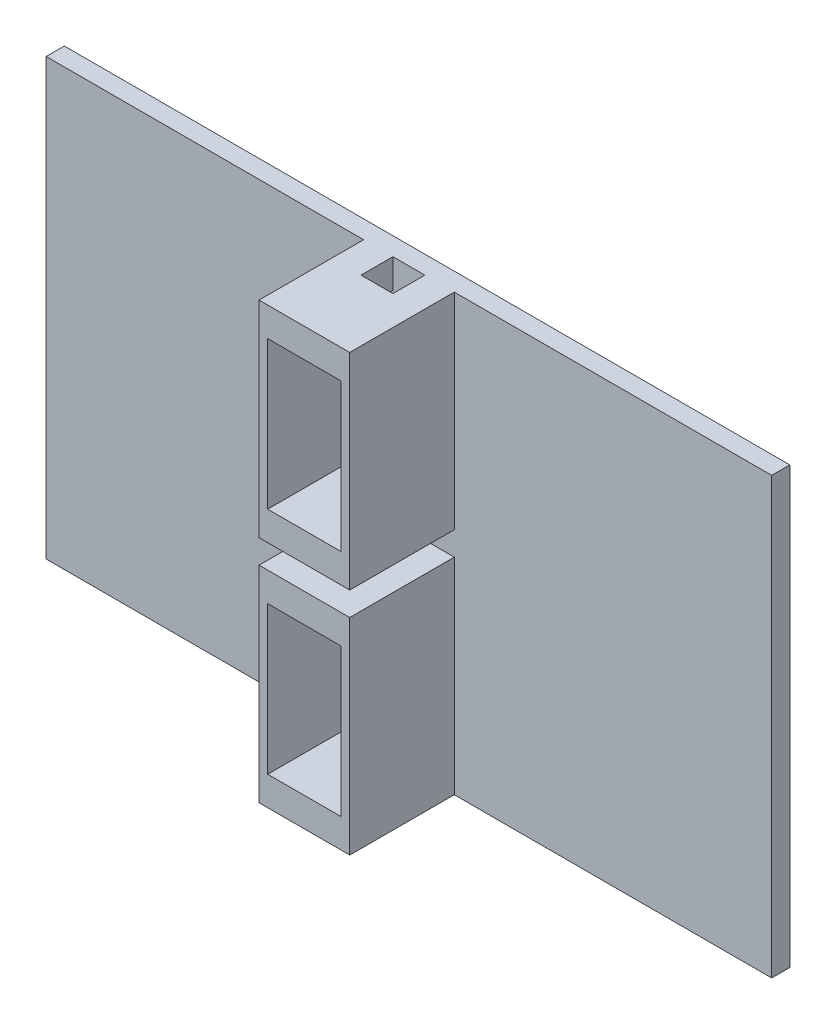
ISO-10303-21;
HEADER;
FILE_DESCRIPTION(('STEP AP214'),'2;1');
FILE_NAME('part.step','',(''),(''),'','','');
FILE_SCHEMA(('AUTOMOTIVE_DESIGN { 1 0 10303 214 1 1 1 1 }'));
ENDSEC;
DATA;
#1=APPLICATION_CONTEXT('core data for automotive mechanical design processes');
#2=APPLICATION_PROTOCOL_DEFINITION('international standard','automotive_design',2000,#1);
#3=PRODUCT_CONTEXT('',#1,'mechanical');
#4=PRODUCT('Part','Part','',(#3));
#5=PRODUCT_RELATED_PRODUCT_CATEGORY('part','',(#4));
#6=PRODUCT_DEFINITION_FORMATION('','',#4);
#7=PRODUCT_DEFINITION_CONTEXT('part definition',#1,'design');
#8=PRODUCT_DEFINITION('design','',#6,#7);
#9=PRODUCT_DEFINITION_SHAPE('','',#8);
#10=(LENGTH_UNIT() NAMED_UNIT(*) SI_UNIT(.MILLI.,.METRE.));
#11=(NAMED_UNIT(*) PLANE_ANGLE_UNIT() SI_UNIT($,.RADIAN.));
#12=(NAMED_UNIT(*) SI_UNIT($,.STERADIAN.) SOLID_ANGLE_UNIT());
#13=UNCERTAINTY_MEASURE_WITH_UNIT(LENGTH_MEASURE(1.E-05),#10,'distance_accuracy_value','');
#14=(GEOMETRIC_REPRESENTATION_CONTEXT(3) GLOBAL_UNCERTAINTY_ASSIGNED_CONTEXT((#13)) GLOBAL_UNIT_ASSIGNED_CONTEXT((#10,
#11,#12)) REPRESENTATION_CONTEXT('',''));
#15=CARTESIAN_POINT('',(0.,0.,0.));
#16=DIRECTION('',(0.,0.,1.));
#17=DIRECTION('',(1.,0.,0.));
#18=AXIS2_PLACEMENT_3D('',#15,#16,#17);
#19=CARTESIAN_POINT('',(0.,0.,33.82));
#20=DIRECTION('',(0.,0.,1.));
#21=DIRECTION('',(1.,0.,0.));
#22=AXIS2_PLACEMENT_3D('',#19,#20,#21);
#23=PLANE('',#22);
#24=DIRECTION('',(1.,0.,0.));
#25=VECTOR('',#24,1.);
#26=CARTESIAN_POINT('',(0.,-3.28,33.82));
#27=LINE('',#26,#25);
#28=CARTESIAN_POINT('',(-12.5,-3.28,33.82));
#29=VERTEX_POINT('',#28);
#30=CARTESIAN_POINT('',(12.5,-3.28,33.82));
#31=VERTEX_POINT('',#30);
#32=EDGE_CURVE('E288',#29,#31,#27,.T.);
#33=ORIENTED_EDGE('',*,*,#32,.F.);
#34=DIRECTION('',(0.,1.,0.));
#35=VECTOR('',#34,1.);
#36=CARTESIAN_POINT('',(-12.5,0.,33.82));
#37=LINE('',#36,#35);
#38=CARTESIAN_POINT('',(-12.5,-60.,33.82));
#39=VERTEX_POINT('',#38);
#40=EDGE_CURVE('E291',#39,#29,#37,.T.);
#41=ORIENTED_EDGE('',*,*,#40,.F.);
#42=DIRECTION('',(-1.,0.,0.));
#43=VECTOR('',#42,1.);
#44=CARTESIAN_POINT('',(0.,-60.,33.82));
#45=LINE('',#44,#43);
#46=CARTESIAN_POINT('',(12.5,-60.,33.82));
#47=VERTEX_POINT('',#46);
#48=EDGE_CURVE('E295',#47,#39,#45,.T.);
#49=ORIENTED_EDGE('',*,*,#48,.F.);
#50=DIRECTION('',(0.,1.,0.));
#51=VECTOR('',#50,1.);
#52=CARTESIAN_POINT('',(12.5,0.,33.82));
#53=LINE('',#52,#51);
#54=EDGE_CURVE('E298',#47,#31,#53,.T.);
#55=ORIENTED_EDGE('',*,*,#54,.T.);
#56=EDGE_LOOP('',(#33,#41,#49,#55));
#57=FACE_BOUND('',#56,.T.);
#58=DIRECTION('',(-1.,0.,0.));
#59=VECTOR('',#58,1.);
#60=CARTESIAN_POINT('',(-10.11,-52.,33.82));
#61=LINE('',#60,#59);
#62=CARTESIAN_POINT('',(10.11,-52.,33.82));
#63=VERTEX_POINT('',#62);
#64=CARTESIAN_POINT('',(-10.11,-52.,33.82));
#65=VERTEX_POINT('',#64);
#66=EDGE_CURVE('E270',#63,#65,#61,.T.);
#67=ORIENTED_EDGE('',*,*,#66,.T.);
#68=DIRECTION('',(0.,1.,0.));
#69=VECTOR('',#68,1.);
#70=CARTESIAN_POINT('',(-10.11,-52.,33.82));
#71=LINE('',#70,#69);
#72=CARTESIAN_POINT('',(-10.1099999999999,-11.28,33.82));
#73=VERTEX_POINT('',#72);
#74=EDGE_CURVE('E255',#65,#73,#71,.T.);
#75=ORIENTED_EDGE('',*,*,#74,.T.);
#76=DIRECTION('',(1.,0.,0.));
#77=VECTOR('',#76,1.);
#78=CARTESIAN_POINT('',(10.11,-11.28,33.82));
#79=LINE('',#78,#77);
#80=CARTESIAN_POINT('',(10.11,-11.28,33.82));
#81=VERTEX_POINT('',#80);
#82=EDGE_CURVE('E260',#73,#81,#79,.T.);
#83=ORIENTED_EDGE('',*,*,#82,.T.);
#84=DIRECTION('',(0.,-1.,0.));
#85=VECTOR('',#84,1.);
#86=CARTESIAN_POINT('',(10.11,-52.,33.82));
#87=LINE('',#86,#85);
#88=EDGE_CURVE('E273',#81,#63,#87,.T.);
#89=ORIENTED_EDGE('',*,*,#88,.T.);
#90=EDGE_LOOP('',(#67,#75,#83,#89));
#91=FACE_BOUND('',#90,.T.);
#92=ADVANCED_FACE('F35',(#57,#91),#23,.T.);
#93=CARTESIAN_POINT('',(100.,60.,5.));
#94=DIRECTION('',(-1.,0.,0.));
#95=DIRECTION('',(0.,0.,1.));
#96=AXIS2_PLACEMENT_3D('',#93,#94,#95);
#97=PLANE('',#96);
#98=DIRECTION('',(0.,1.,0.));
#99=VECTOR('',#98,1.);
#100=CARTESIAN_POINT('',(100.,60.,0.));
#101=LINE('',#100,#99);
#102=CARTESIAN_POINT('',(100.,-60.,0.));
#103=VERTEX_POINT('',#102);
#104=CARTESIAN_POINT('',(100.,60.,0.));
#105=VERTEX_POINT('',#104);
#106=EDGE_CURVE('E403',#103,#105,#101,.T.);
#107=ORIENTED_EDGE('',*,*,#106,.T.);
#108=DIRECTION('',(0.,0.,-1.));
#109=VECTOR('',#108,1.);
#110=CARTESIAN_POINT('',(100.,60.,5.));
#111=LINE('',#110,#109);
#112=CARTESIAN_POINT('',(100.,60.,5.));
#113=VERTEX_POINT('',#112);
#114=EDGE_CURVE('E11',#113,#105,#111,.T.);
#115=ORIENTED_EDGE('',*,*,#114,.F.);
#116=DIRECTION('',(0.,1.,0.));
#117=VECTOR('',#116,1.);
#118=CARTESIAN_POINT('',(100.,60.,5.));
#119=LINE('',#118,#117);
#120=CARTESIAN_POINT('',(100.,-60.,5.));
#121=VERTEX_POINT('',#120);
#122=EDGE_CURVE('E404',#121,#113,#119,.T.);
#123=ORIENTED_EDGE('',*,*,#122,.F.);
#124=DIRECTION('',(0.,0.,-1.));
#125=VECTOR('',#124,1.);
#126=CARTESIAN_POINT('',(100.,-60.,5.));
#127=LINE('',#126,#125);
#128=EDGE_CURVE('E418',#121,#103,#127,.T.);
#129=ORIENTED_EDGE('',*,*,#128,.T.);
#130=EDGE_LOOP('',(#107,#115,#123,#129));
#131=FACE_BOUND('',#130,.T.);
#132=ADVANCED_FACE('F37',(#131),#97,.F.);
#133=CARTESIAN_POINT('',(-100.,60.,5.));
#134=DIRECTION('',(0.,-1.,0.));
#135=DIRECTION('',(0.,0.,-1.));
#136=AXIS2_PLACEMENT_3D('',#133,#134,#135);
#137=PLANE('',#136);
#138=DIRECTION('',(1.,0.,0.));
#139=VECTOR('',#138,1.);
#140=CARTESIAN_POINT('',(-100.,60.,5.));
#141=LINE('',#140,#139);
#142=CARTESIAN_POINT('',(-4.4000000000001,60.,5.));
#143=VERTEX_POINT('',#142);
#144=CARTESIAN_POINT('',(4.3999999999999,60.,4.99999999999999));
#145=VERTEX_POINT('',#144);
#146=EDGE_CURVE('E326',#143,#145,#141,.T.);
#147=ORIENTED_EDGE('',*,*,#146,.T.);
#148=DIRECTION('',(0.,0.,1.));
#149=VECTOR('',#148,1.);
#150=CARTESIAN_POINT('',(4.39999999999989,60.,5.));
#151=LINE('',#150,#149);
#152=CARTESIAN_POINT('',(4.3999999999999,60.,13.8));
#153=VERTEX_POINT('',#152);
#154=EDGE_CURVE('E335',#145,#153,#151,.T.);
#155=ORIENTED_EDGE('',*,*,#154,.T.);
#156=DIRECTION('',(-1.,0.,0.));
#157=VECTOR('',#156,1.);
#158=CARTESIAN_POINT('',(-100.,60.,13.8));
#159=LINE('',#158,#157);
#160=CARTESIAN_POINT('',(-4.4000000000001,60.,13.8));
#161=VERTEX_POINT('',#160);
#162=EDGE_CURVE('E338',#153,#161,#159,.T.);
#163=ORIENTED_EDGE('',*,*,#162,.T.);
#164=DIRECTION('',(0.,0.,-1.));
#165=VECTOR('',#164,1.);
#166=CARTESIAN_POINT('',(-4.40000000000011,60.,5.));
#167=LINE('',#166,#165);
#168=EDGE_CURVE('E341',#161,#143,#167,.T.);
#169=ORIENTED_EDGE('',*,*,#168,.T.);
#170=EDGE_LOOP('',(#147,#155,#163,#169));
#171=FACE_BOUND('',#170,.T.);
#172=DIRECTION('',(0.,0.,-1.));
#173=VECTOR('',#172,1.);
#174=CARTESIAN_POINT('',(12.5,60.,33.82));
#175=LINE('',#174,#173);
#176=CARTESIAN_POINT('',(12.5,60.,33.82));
#177=VERTEX_POINT('',#176);
#178=CARTESIAN_POINT('',(12.5,60.,5.));
#179=VERTEX_POINT('',#178);
#180=EDGE_CURVE('E398',#177,#179,#175,.T.);
#181=ORIENTED_EDGE('',*,*,#180,.T.);
#182=DIRECTION('',(-1.,0.,0.));
#183=VECTOR('',#182,1.);
#184=CARTESIAN_POINT('',(-100.,60.,5.));
#185=LINE('',#184,#183);
#186=EDGE_CURVE('E409',#113,#179,#185,.T.);
#187=ORIENTED_EDGE('',*,*,#186,.F.);
#188=ORIENTED_EDGE('',*,*,#114,.T.);
#189=DIRECTION('',(-1.,0.,0.));
#190=VECTOR('',#189,1.);
#191=CARTESIAN_POINT('',(-100.,60.,0.));
#192=LINE('',#191,#190);
#193=CARTESIAN_POINT('',(-100.,60.,0.));
#194=VERTEX_POINT('',#193);
#195=EDGE_CURVE('E421',#105,#194,#192,.T.);
#196=ORIENTED_EDGE('',*,*,#195,.T.);
#197=DIRECTION('',(0.,0.,-1.));
#198=VECTOR('',#197,1.);
#199=CARTESIAN_POINT('',(-100.,60.,5.));
#200=LINE('',#199,#198);
#201=CARTESIAN_POINT('',(-100.,60.,5.));
#202=VERTEX_POINT('',#201);
#203=EDGE_CURVE('E43',#202,#194,#200,.T.);
#204=ORIENTED_EDGE('',*,*,#203,.F.);
#205=CARTESIAN_POINT('',(-12.5,60.,5.));
#206=VERTEX_POINT('',#205);
#207=EDGE_CURVE('E407',#206,#202,#185,.T.);
#208=ORIENTED_EDGE('',*,*,#207,.F.);
#209=DIRECTION('',(0.,0.,-1.));
#210=VECTOR('',#209,1.);
#211=CARTESIAN_POINT('',(-12.5,60.,33.82));
#212=LINE('',#211,#210);
#213=CARTESIAN_POINT('',(-12.5,60.,33.82));
#214=VERTEX_POINT('',#213);
#215=EDGE_CURVE('E396',#214,#206,#212,.T.);
#216=ORIENTED_EDGE('',*,*,#215,.F.);
#217=DIRECTION('',(-1.,0.,0.));
#218=VECTOR('',#217,1.);
#219=CARTESIAN_POINT('',(0.,60.,33.82));
#220=LINE('',#219,#218);
#221=EDGE_CURVE('E384',#177,#214,#220,.T.);
#222=ORIENTED_EDGE('',*,*,#221,.F.);
#223=EDGE_LOOP('',(#181,#187,#188,#196,#204,#208,#216,#222));
#224=FACE_BOUND('',#223,.T.);
#225=ADVANCED_FACE('F470',(#171,#224),#137,.F.);
#226=CARTESIAN_POINT('',(-100.,60.,5.));
#227=DIRECTION('',(1.,0.,0.));
#228=DIRECTION('',(0.,0.,-1.));
#229=AXIS2_PLACEMENT_3D('',#226,#227,#228);
#230=PLANE('',#229);
#231=DIRECTION('',(0.,-1.,0.));
#232=VECTOR('',#231,1.);
#233=CARTESIAN_POINT('',(-100.,60.,0.));
#234=LINE('',#233,#232);
#235=CARTESIAN_POINT('',(-100.,-60.,0.));
#236=VERTEX_POINT('',#235);
#237=EDGE_CURVE('E423',#194,#236,#234,.T.);
#238=ORIENTED_EDGE('',*,*,#237,.T.);
#239=DIRECTION('',(0.,0.,-1.));
#240=VECTOR('',#239,1.);
#241=CARTESIAN_POINT('',(-100.,-60.,5.));
#242=LINE('',#241,#240);
#243=CARTESIAN_POINT('',(-100.,-60.,5.));
#244=VERTEX_POINT('',#243);
#245=EDGE_CURVE('E428',#244,#236,#242,.T.);
#246=ORIENTED_EDGE('',*,*,#245,.F.);
#247=DIRECTION('',(0.,-1.,0.));
#248=VECTOR('',#247,1.);
#249=CARTESIAN_POINT('',(-100.,60.,5.));
#250=LINE('',#249,#248);
#251=EDGE_CURVE('E412',#202,#244,#250,.T.);
#252=ORIENTED_EDGE('',*,*,#251,.F.);
#253=ORIENTED_EDGE('',*,*,#203,.T.);
#254=EDGE_LOOP('',(#238,#246,#252,#253));
#255=FACE_BOUND('',#254,.T.);
#256=ADVANCED_FACE('F435',(#255),#230,.F.);
#257=CARTESIAN_POINT('',(-100.,-60.,5.));
#258=DIRECTION('',(0.,1.,0.));
#259=DIRECTION('',(0.,0.,1.));
#260=AXIS2_PLACEMENT_3D('',#257,#258,#259);
#261=PLANE('',#260);
#262=DIRECTION('',(-1.,0.,0.));
#263=VECTOR('',#262,1.);
#264=CARTESIAN_POINT('',(-100.,-60.,5.));
#265=LINE('',#264,#263);
#266=CARTESIAN_POINT('',(4.3999999999997,-60.,4.99999999999999));
#267=VERTEX_POINT('',#266);
#268=CARTESIAN_POINT('',(-4.40000000000031,-60.,5.));
#269=VERTEX_POINT('',#268);
#270=EDGE_CURVE('E250',#267,#269,#265,.T.);
#271=ORIENTED_EDGE('',*,*,#270,.T.);
#272=DIRECTION('',(0.,0.,1.));
#273=VECTOR('',#272,1.);
#274=CARTESIAN_POINT('',(-4.40000000000032,-60.,5.));
#275=LINE('',#274,#273);
#276=CARTESIAN_POINT('',(-4.40000000000031,-60.,13.8));
#277=VERTEX_POINT('',#276);
#278=EDGE_CURVE('E253',#269,#277,#275,.T.);
#279=ORIENTED_EDGE('',*,*,#278,.T.);
#280=DIRECTION('',(1.,0.,0.));
#281=VECTOR('',#280,1.);
#282=CARTESIAN_POINT('',(-100.,-60.,13.8));
#283=LINE('',#282,#281);
#284=CARTESIAN_POINT('',(4.3999999999997,-60.,13.8));
#285=VERTEX_POINT('',#284);
#286=EDGE_CURVE('E225',#277,#285,#283,.T.);
#287=ORIENTED_EDGE('',*,*,#286,.T.);
#288=DIRECTION('',(0.,0.,-1.));
#289=VECTOR('',#288,1.);
#290=CARTESIAN_POINT('',(4.3999999999997,-60.,5.00000000000008));
#291=LINE('',#290,#289);
#292=EDGE_CURVE('E247',#285,#267,#291,.T.);
#293=ORIENTED_EDGE('',*,*,#292,.T.);
#294=EDGE_LOOP('',(#271,#279,#287,#293));
#295=FACE_BOUND('',#294,.T.);
#296=DIRECTION('',(1.,0.,0.));
#297=VECTOR('',#296,1.);
#298=CARTESIAN_POINT('',(-100.,-60.,0.));
#299=LINE('',#298,#297);
#300=EDGE_CURVE('E408',#236,#103,#299,.T.);
#301=ORIENTED_EDGE('',*,*,#300,.T.);
#302=ORIENTED_EDGE('',*,*,#128,.F.);
#303=DIRECTION('',(1.,0.,0.));
#304=VECTOR('',#303,1.);
#305=CARTESIAN_POINT('',(-100.,-60.,5.));
#306=LINE('',#305,#304);
#307=CARTESIAN_POINT('',(12.5,-60.,5.));
#308=VERTEX_POINT('',#307);
#309=EDGE_CURVE('E414',#308,#121,#306,.T.);
#310=ORIENTED_EDGE('',*,*,#309,.F.);
#311=DIRECTION('',(0.,0.,-1.));
#312=VECTOR('',#311,1.);
#313=CARTESIAN_POINT('',(12.5,-60.,33.82));
#314=LINE('',#313,#312);
#315=EDGE_CURVE('E309',#47,#308,#314,.T.);
#316=ORIENTED_EDGE('',*,*,#315,.F.);
#317=ORIENTED_EDGE('',*,*,#48,.T.);
#318=DIRECTION('',(0.,0.,-1.));
#319=VECTOR('',#318,1.);
#320=CARTESIAN_POINT('',(-12.5,-60.,33.82));
#321=LINE('',#320,#319);
#322=CARTESIAN_POINT('',(-12.5,-60.,5.));
#323=VERTEX_POINT('',#322);
#324=EDGE_CURVE('E311',#39,#323,#321,.T.);
#325=ORIENTED_EDGE('',*,*,#324,.T.);
#326=EDGE_CURVE('E415',#244,#323,#306,.T.);
#327=ORIENTED_EDGE('',*,*,#326,.F.);
#328=ORIENTED_EDGE('',*,*,#245,.T.);
#329=EDGE_LOOP('',(#301,#302,#310,#316,#317,#325,#327,#328));
#330=FACE_BOUND('',#329,.T.);
#331=ADVANCED_FACE('F445',(#295,#330),#261,.F.);
#332=CARTESIAN_POINT('',(0.,0.,5.));
#333=DIRECTION('',(0.,0.,1.));
#334=DIRECTION('',(1.,0.,0.));
#335=AXIS2_PLACEMENT_3D('',#332,#333,#334);
#336=PLANE('',#335);
#337=DIRECTION('',(0.,1.,0.));
#338=VECTOR('',#337,1.);
#339=CARTESIAN_POINT('',(-12.5,0.,5.));
#340=LINE('',#339,#338);
#341=CARTESIAN_POINT('',(-12.5,-3.28,5.));
#342=VERTEX_POINT('',#341);
#343=EDGE_CURVE('E303',#323,#342,#340,.T.);
#344=ORIENTED_EDGE('',*,*,#343,.T.);
#345=DIRECTION('',(1.,0.,0.));
#346=VECTOR('',#345,1.);
#347=CARTESIAN_POINT('',(0.,-3.28,5.));
#348=LINE('',#347,#346);
#349=CARTESIAN_POINT('',(12.5,-3.28,5.));
#350=VERTEX_POINT('',#349);
#351=EDGE_CURVE('E281',#342,#350,#348,.T.);
#352=ORIENTED_EDGE('',*,*,#351,.T.);
#353=DIRECTION('',(0.,1.,0.));
#354=VECTOR('',#353,1.);
#355=CARTESIAN_POINT('',(12.5,0.,5.));
#356=LINE('',#355,#354);
#357=EDGE_CURVE('E292',#308,#350,#356,.T.);
#358=ORIENTED_EDGE('',*,*,#357,.F.);
#359=ORIENTED_EDGE('',*,*,#309,.T.);
#360=ORIENTED_EDGE('',*,*,#122,.T.);
#361=ORIENTED_EDGE('',*,*,#186,.T.);
#362=DIRECTION('',(0.,-1.,0.));
#363=VECTOR('',#362,1.);
#364=CARTESIAN_POINT('',(12.5,0.,5.));
#365=LINE('',#364,#363);
#366=CARTESIAN_POINT('',(12.5,3.28,5.));
#367=VERTEX_POINT('',#366);
#368=EDGE_CURVE('E390',#179,#367,#365,.T.);
#369=ORIENTED_EDGE('',*,*,#368,.T.);
#370=DIRECTION('',(1.,0.,0.));
#371=VECTOR('',#370,1.);
#372=CARTESIAN_POINT('',(0.,3.28,5.));
#373=LINE('',#372,#371);
#374=CARTESIAN_POINT('',(-12.5,3.28,5.));
#375=VERTEX_POINT('',#374);
#376=EDGE_CURVE('E371',#375,#367,#373,.T.);
#377=ORIENTED_EDGE('',*,*,#376,.F.);
#378=DIRECTION('',(0.,-1.,0.));
#379=VECTOR('',#378,1.);
#380=CARTESIAN_POINT('',(-12.5,0.,5.));
#381=LINE('',#380,#379);
#382=EDGE_CURVE('E381',#206,#375,#381,.T.);
#383=ORIENTED_EDGE('',*,*,#382,.F.);
#384=ORIENTED_EDGE('',*,*,#207,.T.);
#385=ORIENTED_EDGE('',*,*,#251,.T.);
#386=ORIENTED_EDGE('',*,*,#326,.T.);
#387=EDGE_LOOP('',(#344,#352,#358,#359,#360,#361,#369,#377,#383,#384,#385,#386));
#388=FACE_BOUND('',#387,.T.);
#389=ADVANCED_FACE('F452',(#388),#336,.T.);
#390=CARTESIAN_POINT('',(0.,0.,0.));
#391=DIRECTION('',(0.,0.,1.));
#392=DIRECTION('',(1.,0.,0.));
#393=AXIS2_PLACEMENT_3D('',#390,#391,#392);
#394=PLANE('',#393);
#395=ORIENTED_EDGE('',*,*,#106,.F.);
#396=ORIENTED_EDGE('',*,*,#300,.F.);
#397=ORIENTED_EDGE('',*,*,#237,.F.);
#398=ORIENTED_EDGE('',*,*,#195,.F.);
#399=EDGE_LOOP('',(#395,#396,#397,#398));
#400=FACE_BOUND('',#399,.T.);
#401=ADVANCED_FACE('F442',(#400),#394,.F.);
#402=CARTESIAN_POINT('',(0.,3.28,33.82));
#403=DIRECTION('',(0.,1.,0.));
#404=DIRECTION('',(0.,0.,1.));
#405=AXIS2_PLACEMENT_3D('',#402,#403,#404);
#406=PLANE('',#405);
#407=ORIENTED_EDGE('',*,*,#376,.T.);
#408=DIRECTION('',(0.,0.,-1.));
#409=VECTOR('',#408,1.);
#410=CARTESIAN_POINT('',(12.5,3.28,33.82));
#411=LINE('',#410,#409);
#412=CARTESIAN_POINT('',(12.5,3.28,33.82));
#413=VERTEX_POINT('',#412);
#414=EDGE_CURVE('E400',#413,#367,#411,.T.);
#415=ORIENTED_EDGE('',*,*,#414,.F.);
#416=DIRECTION('',(1.,0.,0.));
#417=VECTOR('',#416,1.);
#418=CARTESIAN_POINT('',(0.,3.28,33.82));
#419=LINE('',#418,#417);
#420=CARTESIAN_POINT('',(-12.5,3.28,33.82));
#421=VERTEX_POINT('',#420);
#422=EDGE_CURVE('E378',#421,#413,#419,.T.);
#423=ORIENTED_EDGE('',*,*,#422,.F.);
#424=DIRECTION('',(0.,0.,-1.));
#425=VECTOR('',#424,1.);
#426=CARTESIAN_POINT('',(-12.5,3.28,33.82));
#427=LINE('',#426,#425);
#428=EDGE_CURVE('E388',#421,#375,#427,.T.);
#429=ORIENTED_EDGE('',*,*,#428,.T.);
#430=EDGE_LOOP('',(#407,#415,#423,#429));
#431=FACE_BOUND('',#430,.T.);
#432=ADVANCED_FACE('F485',(#431),#406,.F.);
#433=CARTESIAN_POINT('',(12.5,0.,33.82));
#434=DIRECTION('',(1.,0.,0.));
#435=DIRECTION('',(0.,1.,0.));
#436=AXIS2_PLACEMENT_3D('',#433,#434,#435);
#437=PLANE('',#436);
#438=ORIENTED_EDGE('',*,*,#368,.F.);
#439=ORIENTED_EDGE('',*,*,#180,.F.);
#440=DIRECTION('',(0.,-1.,0.));
#441=VECTOR('',#440,1.);
#442=CARTESIAN_POINT('',(12.5,0.,33.82));
#443=LINE('',#442,#441);
#444=EDGE_CURVE('E380',#177,#413,#443,.T.);
#445=ORIENTED_EDGE('',*,*,#444,.T.);
#446=ORIENTED_EDGE('',*,*,#414,.T.);
#447=EDGE_LOOP('',(#438,#439,#445,#446));
#448=FACE_BOUND('',#447,.T.);
#449=ADVANCED_FACE('F483',(#448),#437,.T.);
#450=CARTESIAN_POINT('',(-12.5,0.,33.82));
#451=DIRECTION('',(1.,0.,0.));
#452=DIRECTION('',(0.,1.,0.));
#453=AXIS2_PLACEMENT_3D('',#450,#451,#452);
#454=PLANE('',#453);
#455=ORIENTED_EDGE('',*,*,#382,.T.);
#456=ORIENTED_EDGE('',*,*,#428,.F.);
#457=DIRECTION('',(0.,-1.,0.));
#458=VECTOR('',#457,1.);
#459=CARTESIAN_POINT('',(-12.5,0.,33.82));
#460=LINE('',#459,#458);
#461=EDGE_CURVE('E386',#214,#421,#460,.T.);
#462=ORIENTED_EDGE('',*,*,#461,.F.);
#463=ORIENTED_EDGE('',*,*,#215,.T.);
#464=EDGE_LOOP('',(#455,#456,#462,#463));
#465=FACE_BOUND('',#464,.T.);
#466=ADVANCED_FACE('F476',(#465),#454,.F.);
#467=CARTESIAN_POINT('',(0.,0.,33.82));
#468=DIRECTION('',(0.,0.,1.));
#469=DIRECTION('',(1.,0.,0.));
#470=AXIS2_PLACEMENT_3D('',#467,#468,#469);
#471=PLANE('',#470);
#472=DIRECTION('',(0.,-1.,0.));
#473=VECTOR('',#472,1.);
#474=CARTESIAN_POINT('',(-10.11,52.,33.82));
#475=LINE('',#474,#473);
#476=CARTESIAN_POINT('',(-10.11,52.,33.82));
#477=VERTEX_POINT('',#476);
#478=CARTESIAN_POINT('',(-10.1099999999999,11.28,33.82));
#479=VERTEX_POINT('',#478);
#480=EDGE_CURVE('E344',#477,#479,#475,.T.);
#481=ORIENTED_EDGE('',*,*,#480,.F.);
#482=DIRECTION('',(-1.,0.,0.));
#483=VECTOR('',#482,1.);
#484=CARTESIAN_POINT('',(-10.11,52.,33.82));
#485=LINE('',#484,#483);
#486=CARTESIAN_POINT('',(10.11,52.,33.82));
#487=VERTEX_POINT('',#486);
#488=EDGE_CURVE('E349',#487,#477,#485,.T.);
#489=ORIENTED_EDGE('',*,*,#488,.F.);
#490=DIRECTION('',(0.,1.,0.));
#491=VECTOR('',#490,1.);
#492=CARTESIAN_POINT('',(10.11,52.,33.82));
#493=LINE('',#492,#491);
#494=CARTESIAN_POINT('',(10.11,11.28,33.82));
#495=VERTEX_POINT('',#494);
#496=EDGE_CURVE('E364',#495,#487,#493,.T.);
#497=ORIENTED_EDGE('',*,*,#496,.F.);
#498=DIRECTION('',(1.,0.,0.));
#499=VECTOR('',#498,1.);
#500=CARTESIAN_POINT('',(10.11,11.28,33.82));
#501=LINE('',#500,#499);
#502=EDGE_CURVE('E361',#479,#495,#501,.T.);
#503=ORIENTED_EDGE('',*,*,#502,.F.);
#504=EDGE_LOOP('',(#481,#489,#497,#503));
#505=FACE_BOUND('',#504,.T.);
#506=ORIENTED_EDGE('',*,*,#422,.T.);
#507=ORIENTED_EDGE('',*,*,#444,.F.);
#508=ORIENTED_EDGE('',*,*,#221,.T.);
#509=ORIENTED_EDGE('',*,*,#461,.T.);
#510=EDGE_LOOP('',(#506,#507,#508,#509));
#511=FACE_BOUND('',#510,.T.);
#512=ADVANCED_FACE('F479',(#505,#511),#471,.T.);
#513=CARTESIAN_POINT('',(-10.11,52.,5.));
#514=DIRECTION('',(-1.,0.,0.));
#515=DIRECTION('',(0.,-1.,0.));
#516=AXIS2_PLACEMENT_3D('',#513,#514,#515);
#517=PLANE('',#516);
#518=ORIENTED_EDGE('',*,*,#480,.T.);
#519=DIRECTION('',(0.,0.,1.));
#520=VECTOR('',#519,1.);
#521=CARTESIAN_POINT('',(-10.1099999999999,11.28,5.));
#522=LINE('',#521,#520);
#523=CARTESIAN_POINT('',(-10.1099999999999,11.28,5.));
#524=VERTEX_POINT('',#523);
#525=EDGE_CURVE('E359',#524,#479,#522,.T.);
#526=ORIENTED_EDGE('',*,*,#525,.F.);
#527=DIRECTION('',(0.,-1.,0.));
#528=VECTOR('',#527,1.);
#529=CARTESIAN_POINT('',(-10.11,52.,5.));
#530=LINE('',#529,#528);
#531=CARTESIAN_POINT('',(-10.11,52.,5.));
#532=VERTEX_POINT('',#531);
#533=EDGE_CURVE('E345',#532,#524,#530,.T.);
#534=ORIENTED_EDGE('',*,*,#533,.F.);
#535=DIRECTION('',(0.,0.,1.));
#536=VECTOR('',#535,1.);
#537=CARTESIAN_POINT('',(-10.11,52.,5.));
#538=LINE('',#537,#536);
#539=EDGE_CURVE('E369',#532,#477,#538,.T.);
#540=ORIENTED_EDGE('',*,*,#539,.T.);
#541=EDGE_LOOP('',(#518,#526,#534,#540));
#542=FACE_BOUND('',#541,.T.);
#543=ADVANCED_FACE('F533',(#542),#517,.F.);
#544=CARTESIAN_POINT('',(-10.11,52.,5.));
#545=DIRECTION('',(0.,1.,0.));
#546=DIRECTION('',(-1.,0.,0.));
#547=AXIS2_PLACEMENT_3D('',#544,#545,#546);
#548=PLANE('',#547);
#549=DIRECTION('',(-1.,0.,0.));
#550=VECTOR('',#549,1.);
#551=CARTESIAN_POINT('',(-10.11,52.,5.));
#552=LINE('',#551,#550);
#553=CARTESIAN_POINT('',(-4.40000000000009,52.,5.));
#554=VERTEX_POINT('',#553);
#555=EDGE_CURVE('E355',#554,#532,#552,.T.);
#556=ORIENTED_EDGE('',*,*,#555,.F.);
#557=DIRECTION('',(0.,0.,-1.));
#558=VECTOR('',#557,1.);
#559=CARTESIAN_POINT('',(-4.40000000000009,52.,5.));
#560=LINE('',#559,#558);
#561=CARTESIAN_POINT('',(-4.40000000000009,52.,13.8));
#562=VERTEX_POINT('',#561);
#563=EDGE_CURVE('E315',#562,#554,#560,.T.);
#564=ORIENTED_EDGE('',*,*,#563,.F.);
#565=DIRECTION('',(-1.,0.,0.));
#566=VECTOR('',#565,1.);
#567=CARTESIAN_POINT('',(-4.40000000000009,52.,13.8));
#568=LINE('',#567,#566);
#569=CARTESIAN_POINT('',(4.39999999999991,52.,13.8));
#570=VERTEX_POINT('',#569);
#571=EDGE_CURVE('E320',#570,#562,#568,.T.);
#572=ORIENTED_EDGE('',*,*,#571,.F.);
#573=DIRECTION('',(0.,0.,1.));
#574=VECTOR('',#573,1.);
#575=CARTESIAN_POINT('',(4.39999999999991,52.,13.8));
#576=LINE('',#575,#574);
#577=CARTESIAN_POINT('',(4.39999999999991,52.,5.));
#578=VERTEX_POINT('',#577);
#579=EDGE_CURVE('E317',#578,#570,#576,.T.);
#580=ORIENTED_EDGE('',*,*,#579,.F.);
#581=CARTESIAN_POINT('',(10.11,52.,5.));
#582=VERTEX_POINT('',#581);
#583=EDGE_CURVE('E356',#582,#578,#552,.T.);
#584=ORIENTED_EDGE('',*,*,#583,.F.);
#585=DIRECTION('',(0.,0.,1.));
#586=VECTOR('',#585,1.);
#587=CARTESIAN_POINT('',(10.11,52.,5.));
#588=LINE('',#587,#586);
#589=EDGE_CURVE('E372',#582,#487,#588,.T.);
#590=ORIENTED_EDGE('',*,*,#589,.T.);
#591=ORIENTED_EDGE('',*,*,#488,.T.);
#592=ORIENTED_EDGE('',*,*,#539,.F.);
#593=EDGE_LOOP('',(#556,#564,#572,#580,#584,#590,#591,#592));
#594=FACE_BOUND('',#593,.T.);
#595=ADVANCED_FACE('F529',(#594),#548,.F.);
#596=CARTESIAN_POINT('',(10.11,52.,5.));
#597=DIRECTION('',(1.,0.,0.));
#598=DIRECTION('',(0.,1.,0.));
#599=AXIS2_PLACEMENT_3D('',#596,#597,#598);
#600=PLANE('',#599);
#601=ORIENTED_EDGE('',*,*,#496,.T.);
#602=ORIENTED_EDGE('',*,*,#589,.F.);
#603=DIRECTION('',(0.,1.,0.));
#604=VECTOR('',#603,1.);
#605=CARTESIAN_POINT('',(10.11,52.,5.));
#606=LINE('',#605,#604);
#607=CARTESIAN_POINT('',(10.11,11.28,5.));
#608=VERTEX_POINT('',#607);
#609=EDGE_CURVE('E352',#608,#582,#606,.T.);
#610=ORIENTED_EDGE('',*,*,#609,.F.);
#611=DIRECTION('',(0.,0.,1.));
#612=VECTOR('',#611,1.);
#613=CARTESIAN_POINT('',(10.11,11.28,5.));
#614=LINE('',#613,#612);
#615=EDGE_CURVE('E374',#608,#495,#614,.T.);
#616=ORIENTED_EDGE('',*,*,#615,.T.);
#617=EDGE_LOOP('',(#601,#602,#610,#616));
#618=FACE_BOUND('',#617,.T.);
#619=ADVANCED_FACE('F532',(#618),#600,.F.);
#620=CARTESIAN_POINT('',(10.11,11.28,5.));
#621=DIRECTION('',(0.,-1.,0.));
#622=DIRECTION('',(1.,0.,0.));
#623=AXIS2_PLACEMENT_3D('',#620,#621,#622);
#624=PLANE('',#623);
#625=ORIENTED_EDGE('',*,*,#502,.T.);
#626=ORIENTED_EDGE('',*,*,#615,.F.);
#627=DIRECTION('',(1.,0.,0.));
#628=VECTOR('',#627,1.);
#629=CARTESIAN_POINT('',(10.11,11.28,5.));
#630=LINE('',#629,#628);
#631=EDGE_CURVE('E348',#524,#608,#630,.T.);
#632=ORIENTED_EDGE('',*,*,#631,.F.);
#633=ORIENTED_EDGE('',*,*,#525,.T.);
#634=EDGE_LOOP('',(#625,#626,#632,#633));
#635=FACE_BOUND('',#634,.T.);
#636=ADVANCED_FACE('F527',(#635),#624,.F.);
#637=CARTESIAN_POINT('',(0.,0.,5.));
#638=DIRECTION('',(0.,0.,-1.));
#639=DIRECTION('',(-1.,0.,0.));
#640=AXIS2_PLACEMENT_3D('',#637,#638,#639);
#641=PLANE('',#640);
#642=ORIENTED_EDGE('',*,*,#533,.T.);
#643=ORIENTED_EDGE('',*,*,#631,.T.);
#644=ORIENTED_EDGE('',*,*,#609,.T.);
#645=ORIENTED_EDGE('',*,*,#583,.T.);
#646=DIRECTION('',(0.,-1.,0.));
#647=VECTOR('',#646,1.);
#648=CARTESIAN_POINT('',(4.39999999999988,71.82,5.));
#649=LINE('',#648,#647);
#650=EDGE_CURVE('E329',#145,#578,#649,.T.);
#651=ORIENTED_EDGE('',*,*,#650,.F.);
#652=ORIENTED_EDGE('',*,*,#146,.F.);
#653=DIRECTION('',(0.,-1.,0.));
#654=VECTOR('',#653,1.);
#655=CARTESIAN_POINT('',(-4.40000000000012,71.82,5.));
#656=LINE('',#655,#654);
#657=EDGE_CURVE('E323',#143,#554,#656,.T.);
#658=ORIENTED_EDGE('',*,*,#657,.T.);
#659=ORIENTED_EDGE('',*,*,#555,.T.);
#660=EDGE_LOOP('',(#642,#643,#644,#645,#651,#652,#658,#659));
#661=FACE_BOUND('',#660,.T.);
#662=ADVANCED_FACE('F523',(#661),#641,.F.);
#663=CARTESIAN_POINT('',(-4.40000000000012,71.82,5.));
#664=DIRECTION('',(-1.,0.,0.));
#665=DIRECTION('',(0.,-1.,0.));
#666=AXIS2_PLACEMENT_3D('',#663,#664,#665);
#667=PLANE('',#666);
#668=DIRECTION('',(0.,-1.,0.));
#669=VECTOR('',#668,1.);
#670=CARTESIAN_POINT('',(-4.40000000000012,71.82,13.8));
#671=LINE('',#670,#669);
#672=EDGE_CURVE('E324',#161,#562,#671,.T.);
#673=ORIENTED_EDGE('',*,*,#672,.T.);
#674=ORIENTED_EDGE('',*,*,#563,.T.);
#675=ORIENTED_EDGE('',*,*,#657,.F.);
#676=ORIENTED_EDGE('',*,*,#168,.F.);
#677=EDGE_LOOP('',(#673,#674,#675,#676));
#678=FACE_BOUND('',#677,.T.);
#679=ADVANCED_FACE('F516',(#678),#667,.F.);
#680=CARTESIAN_POINT('',(-4.40000000000012,71.82,13.8));
#681=DIRECTION('',(0.,0.,1.));
#682=DIRECTION('',(1.,0.,0.));
#683=AXIS2_PLACEMENT_3D('',#680,#681,#682);
#684=PLANE('',#683);
#685=DIRECTION('',(0.,-1.,0.));
#686=VECTOR('',#685,1.);
#687=CARTESIAN_POINT('',(4.39999999999988,71.82,13.8));
#688=LINE('',#687,#686);
#689=EDGE_CURVE('E327',#153,#570,#688,.T.);
#690=ORIENTED_EDGE('',*,*,#689,.T.);
#691=ORIENTED_EDGE('',*,*,#571,.T.);
#692=ORIENTED_EDGE('',*,*,#672,.F.);
#693=ORIENTED_EDGE('',*,*,#162,.F.);
#694=EDGE_LOOP('',(#690,#691,#692,#693));
#695=FACE_BOUND('',#694,.T.);
#696=ADVANCED_FACE('F513',(#695),#684,.F.);
#697=CARTESIAN_POINT('',(4.39999999999988,71.82,13.8));
#698=DIRECTION('',(1.,0.,0.));
#699=DIRECTION('',(0.,1.,0.));
#700=AXIS2_PLACEMENT_3D('',#697,#698,#699);
#701=PLANE('',#700);
#702=ORIENTED_EDGE('',*,*,#650,.T.);
#703=ORIENTED_EDGE('',*,*,#579,.T.);
#704=ORIENTED_EDGE('',*,*,#689,.F.);
#705=ORIENTED_EDGE('',*,*,#154,.F.);
#706=EDGE_LOOP('',(#702,#703,#704,#705));
#707=FACE_BOUND('',#706,.T.);
#708=ADVANCED_FACE('F511',(#707),#701,.F.);
#709=CARTESIAN_POINT('',(0.,-3.28,33.82));
#710=DIRECTION('',(0.,1.,0.));
#711=DIRECTION('',(0.,0.,1.));
#712=AXIS2_PLACEMENT_3D('',#709,#710,#711);
#713=PLANE('',#712);
#714=ORIENTED_EDGE('',*,*,#351,.F.);
#715=DIRECTION('',(0.,0.,-1.));
#716=VECTOR('',#715,1.);
#717=CARTESIAN_POINT('',(-12.5,-3.28,33.82));
#718=LINE('',#717,#716);
#719=EDGE_CURVE('E313',#29,#342,#718,.T.);
#720=ORIENTED_EDGE('',*,*,#719,.F.);
#721=ORIENTED_EDGE('',*,*,#32,.T.);
#722=DIRECTION('',(0.,0.,-1.));
#723=VECTOR('',#722,1.);
#724=CARTESIAN_POINT('',(12.5,-3.28,33.82));
#725=LINE('',#724,#723);
#726=EDGE_CURVE('E300',#31,#350,#725,.T.);
#727=ORIENTED_EDGE('',*,*,#726,.T.);
#728=EDGE_LOOP('',(#714,#720,#721,#727));
#729=FACE_BOUND('',#728,.T.);
#730=ADVANCED_FACE('F508',(#729),#713,.T.);
#731=CARTESIAN_POINT('',(-12.5,0.,33.82));
#732=DIRECTION('',(-1.,0.,0.));
#733=DIRECTION('',(0.,-1.,0.));
#734=AXIS2_PLACEMENT_3D('',#731,#732,#733);
#735=PLANE('',#734);
#736=ORIENTED_EDGE('',*,*,#343,.F.);
#737=ORIENTED_EDGE('',*,*,#324,.F.);
#738=ORIENTED_EDGE('',*,*,#40,.T.);
#739=ORIENTED_EDGE('',*,*,#719,.T.);
#740=EDGE_LOOP('',(#736,#737,#738,#739));
#741=FACE_BOUND('',#740,.T.);
#742=ADVANCED_FACE('F465',(#741),#735,.T.);
#743=CARTESIAN_POINT('',(12.5,0.,33.82));
#744=DIRECTION('',(-1.,0.,0.));
#745=DIRECTION('',(0.,-1.,0.));
#746=AXIS2_PLACEMENT_3D('',#743,#744,#745);
#747=PLANE('',#746);
#748=ORIENTED_EDGE('',*,*,#357,.T.);
#749=ORIENTED_EDGE('',*,*,#726,.F.);
#750=ORIENTED_EDGE('',*,*,#54,.F.);
#751=ORIENTED_EDGE('',*,*,#315,.T.);
#752=EDGE_LOOP('',(#748,#749,#750,#751));
#753=FACE_BOUND('',#752,.T.);
#754=ADVANCED_FACE('F458',(#753),#747,.F.);
#755=CARTESIAN_POINT('',(-10.11,-52.,5.));
#756=DIRECTION('',(1.,0.,0.));
#757=DIRECTION('',(0.,1.,0.));
#758=AXIS2_PLACEMENT_3D('',#755,#756,#757);
#759=PLANE('',#758);
#760=ORIENTED_EDGE('',*,*,#74,.F.);
#761=DIRECTION('',(0.,0.,1.));
#762=VECTOR('',#761,1.);
#763=CARTESIAN_POINT('',(-10.11,-52.,5.));
#764=LINE('',#763,#762);
#765=CARTESIAN_POINT('',(-10.11,-52.,5.));
#766=VERTEX_POINT('',#765);
#767=EDGE_CURVE('E267',#766,#65,#764,.T.);
#768=ORIENTED_EDGE('',*,*,#767,.F.);
#769=DIRECTION('',(0.,1.,0.));
#770=VECTOR('',#769,1.);
#771=CARTESIAN_POINT('',(-10.11,-52.,5.));
#772=LINE('',#771,#770);
#773=CARTESIAN_POINT('',(-10.1099999999999,-11.28,5.));
#774=VERTEX_POINT('',#773);
#775=EDGE_CURVE('E256',#766,#774,#772,.T.);
#776=ORIENTED_EDGE('',*,*,#775,.T.);
#777=DIRECTION('',(0.,0.,1.));
#778=VECTOR('',#777,1.);
#779=CARTESIAN_POINT('',(-10.1099999999999,-11.28,5.));
#780=LINE('',#779,#778);
#781=EDGE_CURVE('E278',#774,#73,#780,.T.);
#782=ORIENTED_EDGE('',*,*,#781,.T.);
#783=EDGE_LOOP('',(#760,#768,#776,#782));
#784=FACE_BOUND('',#783,.T.);
#785=ADVANCED_FACE('F502',(#784),#759,.T.);
#786=CARTESIAN_POINT('',(10.11,-11.28,5.));
#787=DIRECTION('',(0.,-1.,0.));
#788=DIRECTION('',(1.,0.,0.));
#789=AXIS2_PLACEMENT_3D('',#786,#787,#788);
#790=PLANE('',#789);
#791=ORIENTED_EDGE('',*,*,#82,.F.);
#792=ORIENTED_EDGE('',*,*,#781,.F.);
#793=DIRECTION('',(1.,0.,0.));
#794=VECTOR('',#793,1.);
#795=CARTESIAN_POINT('',(10.11,-11.28,5.));
#796=LINE('',#795,#794);
#797=CARTESIAN_POINT('',(10.11,-11.28,5.));
#798=VERTEX_POINT('',#797);
#799=EDGE_CURVE('E265',#774,#798,#796,.T.);
#800=ORIENTED_EDGE('',*,*,#799,.T.);
#801=DIRECTION('',(0.,0.,1.));
#802=VECTOR('',#801,1.);
#803=CARTESIAN_POINT('',(10.11,-11.28,5.));
#804=LINE('',#803,#802);
#805=EDGE_CURVE('E282',#798,#81,#804,.T.);
#806=ORIENTED_EDGE('',*,*,#805,.T.);
#807=EDGE_LOOP('',(#791,#792,#800,#806));
#808=FACE_BOUND('',#807,.T.);
#809=ADVANCED_FACE('F607',(#808),#790,.T.);
#810=CARTESIAN_POINT('',(10.11,-52.,5.));
#811=DIRECTION('',(-1.,0.,0.));
#812=DIRECTION('',(0.,-1.,0.));
#813=AXIS2_PLACEMENT_3D('',#810,#811,#812);
#814=PLANE('',#813);
#815=ORIENTED_EDGE('',*,*,#88,.F.);
#816=ORIENTED_EDGE('',*,*,#805,.F.);
#817=DIRECTION('',(0.,-1.,0.));
#818=VECTOR('',#817,1.);
#819=CARTESIAN_POINT('',(10.11,-52.,5.));
#820=LINE('',#819,#818);
#821=CARTESIAN_POINT('',(10.11,-52.,5.));
#822=VERTEX_POINT('',#821);
#823=EDGE_CURVE('E263',#798,#822,#820,.T.);
#824=ORIENTED_EDGE('',*,*,#823,.T.);
#825=DIRECTION('',(0.,0.,1.));
#826=VECTOR('',#825,1.);
#827=CARTESIAN_POINT('',(10.11,-52.,5.));
#828=LINE('',#827,#826);
#829=EDGE_CURVE('E284',#822,#63,#828,.T.);
#830=ORIENTED_EDGE('',*,*,#829,.T.);
#831=EDGE_LOOP('',(#815,#816,#824,#830));
#832=FACE_BOUND('',#831,.T.);
#833=ADVANCED_FACE('F614',(#832),#814,.T.);
#834=CARTESIAN_POINT('',(-10.11,-52.,5.));
#835=DIRECTION('',(0.,1.,0.));
#836=DIRECTION('',(-1.,0.,0.));
#837=AXIS2_PLACEMENT_3D('',#834,#835,#836);
#838=PLANE('',#837);
#839=DIRECTION('',(0.,0.,1.));
#840=VECTOR('',#839,1.);
#841=CARTESIAN_POINT('',(-4.4000000000003,-52.,13.8));
#842=LINE('',#841,#840);
#843=CARTESIAN_POINT('',(-4.4000000000003,-52.,5.));
#844=VERTEX_POINT('',#843);
#845=CARTESIAN_POINT('',(-4.4000000000003,-52.,13.8));
#846=VERTEX_POINT('',#845);
#847=EDGE_CURVE('E230',#844,#846,#842,.T.);
#848=ORIENTED_EDGE('',*,*,#847,.F.);
#849=DIRECTION('',(-1.,0.,0.));
#850=VECTOR('',#849,1.);
#851=CARTESIAN_POINT('',(-10.11,-52.,5.));
#852=LINE('',#851,#850);
#853=EDGE_CURVE('E259',#844,#766,#852,.T.);
#854=ORIENTED_EDGE('',*,*,#853,.T.);
#855=ORIENTED_EDGE('',*,*,#767,.T.);
#856=ORIENTED_EDGE('',*,*,#66,.F.);
#857=ORIENTED_EDGE('',*,*,#829,.F.);
#858=CARTESIAN_POINT('',(4.39999999999971,-52.,5.));
#859=VERTEX_POINT('',#858);
#860=EDGE_CURVE('E261',#822,#859,#852,.T.);
#861=ORIENTED_EDGE('',*,*,#860,.T.);
#862=DIRECTION('',(0.,0.,-1.));
#863=VECTOR('',#862,1.);
#864=CARTESIAN_POINT('',(4.39999999999971,-52.,4.99999999999999));
#865=LINE('',#864,#863);
#866=CARTESIAN_POINT('',(4.3999999999997,-52.,13.8));
#867=VERTEX_POINT('',#866);
#868=EDGE_CURVE('E57',#867,#859,#865,.T.);
#869=ORIENTED_EDGE('',*,*,#868,.F.);
#870=DIRECTION('',(1.,0.,0.));
#871=VECTOR('',#870,1.);
#872=CARTESIAN_POINT('',(4.3999999999997,-52.,13.8));
#873=LINE('',#872,#871);
#874=EDGE_CURVE('E223',#846,#867,#873,.T.);
#875=ORIENTED_EDGE('',*,*,#874,.F.);
#876=EDGE_LOOP('',(#848,#854,#855,#856,#857,#861,#869,#875));
#877=FACE_BOUND('',#876,.T.);
#878=ADVANCED_FACE('F237',(#877),#838,.T.);
#879=CARTESIAN_POINT('',(0.,0.,5.));
#880=DIRECTION('',(0.,0.,-1.));
#881=DIRECTION('',(-1.,0.,0.));
#882=AXIS2_PLACEMENT_3D('',#879,#880,#881);
#883=PLANE('',#882);
#884=ORIENTED_EDGE('',*,*,#775,.F.);
#885=ORIENTED_EDGE('',*,*,#853,.F.);
#886=DIRECTION('',(0.,1.,0.));
#887=VECTOR('',#886,1.);
#888=CARTESIAN_POINT('',(-4.40000000000033,-71.82,5.));
#889=LINE('',#888,#887);
#890=EDGE_CURVE('E233',#269,#844,#889,.T.);
#891=ORIENTED_EDGE('',*,*,#890,.F.);
#892=ORIENTED_EDGE('',*,*,#270,.F.);
#893=DIRECTION('',(0.,1.,0.));
#894=VECTOR('',#893,1.);
#895=CARTESIAN_POINT('',(4.39999999999968,-71.82,4.99999999999999));
#896=LINE('',#895,#894);
#897=EDGE_CURVE('E243',#267,#859,#896,.T.);
#898=ORIENTED_EDGE('',*,*,#897,.T.);
#899=ORIENTED_EDGE('',*,*,#860,.F.);
#900=ORIENTED_EDGE('',*,*,#823,.F.);
#901=ORIENTED_EDGE('',*,*,#799,.F.);
#902=EDGE_LOOP('',(#884,#885,#891,#892,#898,#899,#900,#901));
#903=FACE_BOUND('',#902,.T.);
#904=ADVANCED_FACE('F631',(#903),#883,.F.);
#905=CARTESIAN_POINT('',(-4.40000000000033,-71.82,13.8));
#906=DIRECTION('',(-1.,0.,0.));
#907=DIRECTION('',(0.,-1.,0.));
#908=AXIS2_PLACEMENT_3D('',#905,#906,#907);
#909=PLANE('',#908);
#910=ORIENTED_EDGE('',*,*,#890,.T.);
#911=ORIENTED_EDGE('',*,*,#847,.T.);
#912=DIRECTION('',(0.,1.,0.));
#913=VECTOR('',#912,1.);
#914=CARTESIAN_POINT('',(-4.40000000000033,-71.82,13.8));
#915=LINE('',#914,#913);
#916=EDGE_CURVE('E219',#277,#846,#915,.T.);
#917=ORIENTED_EDGE('',*,*,#916,.F.);
#918=ORIENTED_EDGE('',*,*,#278,.F.);
#919=EDGE_LOOP('',(#910,#911,#917,#918));
#920=FACE_BOUND('',#919,.T.);
#921=ADVANCED_FACE('F231',(#920),#909,.F.);
#922=CARTESIAN_POINT('',(4.39999999999968,-71.82,4.99999999999999));
#923=DIRECTION('',(1.,0.,0.));
#924=DIRECTION('',(0.,1.,0.));
#925=AXIS2_PLACEMENT_3D('',#922,#923,#924);
#926=PLANE('',#925);
#927=DIRECTION('',(0.,1.,0.));
#928=VECTOR('',#927,1.);
#929=CARTESIAN_POINT('',(4.39999999999967,-71.82,13.8));
#930=LINE('',#929,#928);
#931=EDGE_CURVE('E50',#285,#867,#930,.T.);
#932=ORIENTED_EDGE('',*,*,#931,.T.);
#933=ORIENTED_EDGE('',*,*,#868,.T.);
#934=ORIENTED_EDGE('',*,*,#897,.F.);
#935=ORIENTED_EDGE('',*,*,#292,.F.);
#936=EDGE_LOOP('',(#932,#933,#934,#935));
#937=FACE_BOUND('',#936,.T.);
#938=ADVANCED_FACE('F646',(#937),#926,.F.);
#939=CARTESIAN_POINT('',(4.39999999999967,-71.82,13.8));
#940=DIRECTION('',(0.,0.,1.));
#941=DIRECTION('',(1.,0.,0.));
#942=AXIS2_PLACEMENT_3D('',#939,#940,#941);
#943=PLANE('',#942);
#944=ORIENTED_EDGE('',*,*,#916,.T.);
#945=ORIENTED_EDGE('',*,*,#874,.T.);
#946=ORIENTED_EDGE('',*,*,#931,.F.);
#947=ORIENTED_EDGE('',*,*,#286,.F.);
#948=EDGE_LOOP('',(#944,#945,#946,#947));
#949=FACE_BOUND('',#948,.T.);
#950=ADVANCED_FACE('F221',(#949),#943,.F.);
#951=CLOSED_SHELL('',(#92,#132,#225,#256,#331,#389,#401,#432,#449,#466,#512,#543,#595,#619,#636,
#662,#679,#696,#708,#730,#742,#754,#785,#809,#833,#878,#904,#921,#938,#950));
#952=MANIFOLD_SOLID_BREP('B2',#951);
#953=ADVANCED_BREP_SHAPE_REPRESENTATION('',(#18,#952),#14);
#954=SHAPE_DEFINITION_REPRESENTATION(#9,#953);
ENDSEC;
END-ISO-10303-21;
